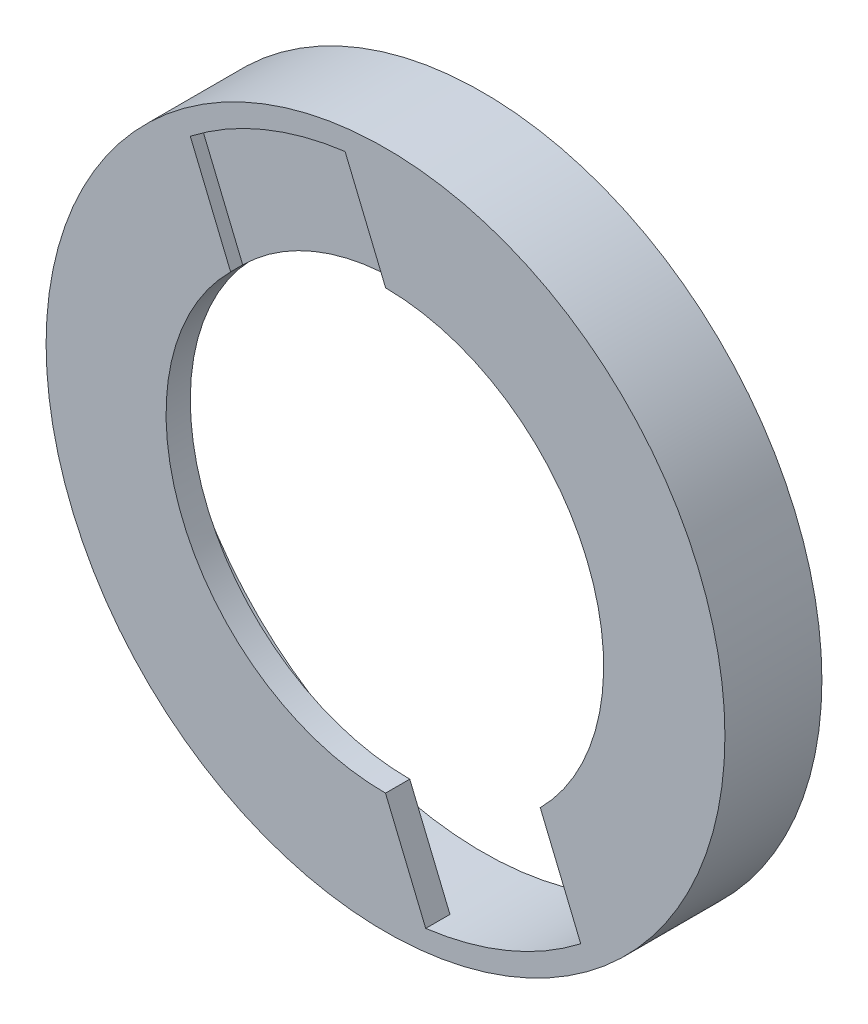
ISO-10303-21;
HEADER;
FILE_DESCRIPTION(('STEP AP214'),'2;1');
FILE_NAME('part.step','',(''),(''),'','','');
FILE_SCHEMA(('AUTOMOTIVE_DESIGN { 1 0 10303 214 1 1 1 1 }'));
ENDSEC;
DATA;
#1=APPLICATION_CONTEXT('core data for automotive mechanical design processes');
#2=APPLICATION_PROTOCOL_DEFINITION('international standard','automotive_design',2000,#1);
#3=PRODUCT_CONTEXT('',#1,'mechanical');
#4=PRODUCT('Part','Part','',(#3));
#5=PRODUCT_RELATED_PRODUCT_CATEGORY('part','',(#4));
#6=PRODUCT_DEFINITION_FORMATION('','',#4);
#7=PRODUCT_DEFINITION_CONTEXT('part definition',#1,'design');
#8=PRODUCT_DEFINITION('design','',#6,#7);
#9=PRODUCT_DEFINITION_SHAPE('','',#8);
#10=(LENGTH_UNIT() NAMED_UNIT(*) SI_UNIT(.MILLI.,.METRE.));
#11=(NAMED_UNIT(*) PLANE_ANGLE_UNIT() SI_UNIT($,.RADIAN.));
#12=(NAMED_UNIT(*) SI_UNIT($,.STERADIAN.) SOLID_ANGLE_UNIT());
#13=UNCERTAINTY_MEASURE_WITH_UNIT(LENGTH_MEASURE(1.E-05),#10,'distance_accuracy_value','');
#14=(GEOMETRIC_REPRESENTATION_CONTEXT(3) GLOBAL_UNCERTAINTY_ASSIGNED_CONTEXT((#13)) GLOBAL_UNIT_ASSIGNED_CONTEXT((#10,
#11,#12)) REPRESENTATION_CONTEXT('',''));
#15=CARTESIAN_POINT('',(0.,0.,0.));
#16=DIRECTION('',(0.,0.,1.));
#17=DIRECTION('',(1.,0.,0.));
#18=AXIS2_PLACEMENT_3D('',#15,#16,#17);
#19=CARTESIAN_POINT('',(0.0268247608232734,0.0172292833440261,0.));
#20=DIRECTION('',(0.,0.,1.));
#21=DIRECTION('',(1.,0.,0.));
#22=AXIS2_PLACEMENT_3D('',#19,#20,#21);
#23=PLANE('',#22);
#24=DIRECTION('',(0.38268343236509,-0.923879532511287,0.));
#25=VECTOR('',#24,1.);
#26=CARTESIAN_POINT('',(-3.16790889002571,-1.31219082661095,0.));
#27=LINE('',#26,#25);
#28=CARTESIAN_POINT('',(0.0268247608232715,-9.02496013466025,0.));
#29=VERTEX_POINT('',#28);
#30=CARTESIAN_POINT('',(1.68486505903116,-13.0278235095549,0.));
#31=VERTEX_POINT('',#30);
#32=EDGE_CURVE('E56',#29,#31,#27,.T.);
#33=ORIENTED_EDGE('',*,*,#32,.T.);
#34=CARTESIAN_POINT('',(0.0268247608232734,0.0172292833440261,0.));
#35=DIRECTION('',(0.,0.,1.));
#36=DIRECTION('',(1.,0.,0.));
#37=AXIS2_PLACEMENT_3D('',#34,#35,#36);
#38=CIRCLE('',#37,13.15);
#39=CARTESIAN_POINT('',(8.07865851327523,-10.3794275457946,0.));
#40=VERTEX_POINT('',#39);
#41=EDGE_CURVE('E179',#40,#31,#38,.T.);
#42=ORIENTED_EDGE('',*,*,#41,.F.);
#43=DIRECTION('',(0.38268343236509,-0.923879532511287,0.));
#44=VECTOR('',#43,1.);
#45=CARTESIAN_POINT('',(3.22588456421837,1.33620513714927,0.));
#46=LINE('',#45,#44);
#47=CARTESIAN_POINT('',(6.42061821506745,-6.37656417090026,0.));
#48=VERTEX_POINT('',#47);
#49=EDGE_CURVE('E156',#48,#40,#46,.T.);
#50=ORIENTED_EDGE('',*,*,#49,.F.);
#51=DIRECTION('',(0.707106781186541,-0.707106781186554,0.));
#52=VECTOR('',#51,1.);
#53=CARTESIAN_POINT('',(0.02202702208365,0.0220270220836496,0.));
#54=LINE('',#53,#52);
#55=CARTESIAN_POINT('',(6.40362770767166,-6.35957366350448,0.));
#56=VERTEX_POINT('',#55);
#57=EDGE_CURVE('E137',#56,#48,#54,.T.);
#58=ORIENTED_EDGE('',*,*,#57,.F.);
#59=CARTESIAN_POINT('',(0.,0.,0.));
#60=DIRECTION('',(0.,0.,1.));
#61=DIRECTION('',(1.,0.,0.));
#62=AXIS2_PLACEMENT_3D('',#59,#60,#61);
#63=CIRCLE('',#62,9.025);
#64=EDGE_CURVE('E162',#56,#29,#63,.T.);
#65=ORIENTED_EDGE('',*,*,#64,.T.);
#66=EDGE_LOOP('',(#33,#42,#50,#58,#65));
#67=FACE_BOUND('',#66,.T.);
#68=ADVANCED_FACE('F33',(#67),#23,.F.);
#69=CARTESIAN_POINT('',(0.0268247608232734,0.0172292833440261,-3.));
#70=DIRECTION('',(0.,0.,1.));
#71=DIRECTION('',(1.,0.,0.));
#72=AXIS2_PLACEMENT_3D('',#69,#70,#71);
#73=CYLINDRICAL_SURFACE('',#72,14.);
#74=CARTESIAN_POINT('',(0.0268247608232734,0.0172292833440261,-3.));
#75=DIRECTION('',(0.,0.,1.));
#76=DIRECTION('',(1.,0.,0.));
#77=AXIS2_PLACEMENT_3D('',#74,#75,#76);
#78=CIRCLE('',#77,14.);
#79=CARTESIAN_POINT('',(14.0268247608233,0.0172292833440261,-3.));
#80=VERTEX_POINT('',#79);
#81=EDGE_CURVE('E11',#80,#80,#78,.T.);
#82=ORIENTED_EDGE('',*,*,#81,.T.);
#83=EDGE_LOOP('',(#82));
#84=FACE_BOUND('',#83,.T.);
#85=CARTESIAN_POINT('',(0.0268247608232734,0.0172292833440261,1.));
#86=DIRECTION('',(0.,0.,1.));
#87=DIRECTION('',(1.,0.,0.));
#88=AXIS2_PLACEMENT_3D('',#85,#86,#87);
#89=CIRCLE('',#88,14.);
#90=CARTESIAN_POINT('',(14.0268247608233,0.0172292833440261,1.));
#91=VERTEX_POINT('',#90);
#92=EDGE_CURVE('E173',#91,#91,#89,.T.);
#93=ORIENTED_EDGE('',*,*,#92,.F.);
#94=EDGE_LOOP('',(#93));
#95=FACE_BOUND('',#94,.T.);
#96=ADVANCED_FACE('F35',(#84,#95),#73,.T.);
#97=CARTESIAN_POINT('',(0.0268247608232734,0.0172292833440261,-3.));
#98=DIRECTION('',(0.,0.,1.));
#99=DIRECTION('',(1.,0.,0.));
#100=AXIS2_PLACEMENT_3D('',#97,#98,#99);
#101=PLANE('',#100);
#102=CARTESIAN_POINT('',(0.0268247608232734,0.0172292833440261,-3.));
#103=DIRECTION('',(0.,0.,1.));
#104=DIRECTION('',(1.,0.,0.));
#105=AXIS2_PLACEMENT_3D('',#102,#103,#104);
#106=CIRCLE('',#105,13.15);
#107=CARTESIAN_POINT('',(13.1768247608233,0.0172292833440261,-3.));
#108=VERTEX_POINT('',#107);
#109=EDGE_CURVE('E41',#108,#108,#106,.T.);
#110=ORIENTED_EDGE('',*,*,#109,.T.);
#111=EDGE_LOOP('',(#110));
#112=FACE_BOUND('',#111,.T.);
#113=ORIENTED_EDGE('',*,*,#81,.F.);
#114=EDGE_LOOP('',(#113));
#115=FACE_BOUND('',#114,.T.);
#116=ADVANCED_FACE('F220',(#112,#115),#101,.F.);
#117=CARTESIAN_POINT('',(0.0268247608232734,0.0172292833440261,-3.));
#118=DIRECTION('',(0.,0.,1.));
#119=DIRECTION('',(1.,0.,0.));
#120=AXIS2_PLACEMENT_3D('',#117,#118,#119);
#121=CYLINDRICAL_SURFACE('',#120,13.15);
#122=ORIENTED_EDGE('',*,*,#109,.F.);
#123=EDGE_LOOP('',(#122));
#124=FACE_BOUND('',#123,.T.);
#125=ORIENTED_EDGE('',*,*,#41,.T.);
#126=DIRECTION('',(0.,0.,-1.));
#127=VECTOR('',#126,1.);
#128=CARTESIAN_POINT('',(1.68486505903116,-13.0278235095549,1.));
#129=LINE('',#128,#127);
#130=CARTESIAN_POINT('',(1.68486505903116,-13.0278235095549,1.));
#131=VERTEX_POINT('',#130);
#132=EDGE_CURVE('E165',#131,#31,#129,.T.);
#133=ORIENTED_EDGE('',*,*,#132,.F.);
#134=CARTESIAN_POINT('',(0.0268247608232734,0.0172292833440261,1.));
#135=DIRECTION('',(0.,0.,-1.));
#136=DIRECTION('',(-1.,0.,0.));
#137=AXIS2_PLACEMENT_3D('',#134,#135,#136);
#138=CIRCLE('',#137,13.15);
#139=CARTESIAN_POINT('',(8.07865851327523,-10.3794275457946,1.));
#140=VERTEX_POINT('',#139);
#141=EDGE_CURVE('E148',#140,#131,#138,.T.);
#142=ORIENTED_EDGE('',*,*,#141,.F.);
#143=DIRECTION('',(0.,0.,-1.));
#144=VECTOR('',#143,1.);
#145=CARTESIAN_POINT('',(8.07865851327523,-10.3794275457946,1.));
#146=LINE('',#145,#144);
#147=EDGE_CURVE('E167',#140,#40,#146,.T.);
#148=ORIENTED_EDGE('',*,*,#147,.T.);
#149=EDGE_LOOP('',(#125,#133,#142,#148));
#150=FACE_BOUND('',#149,.T.);
#151=ADVANCED_FACE('F185',(#124,#150),#121,.F.);
#152=CARTESIAN_POINT('',(0.0268247608232734,0.0172292833440261,1.));
#153=DIRECTION('',(0.,0.,1.));
#154=DIRECTION('',(1.,0.,0.));
#155=AXIS2_PLACEMENT_3D('',#152,#153,#154);
#156=PLANE('',#155);
#157=DIRECTION('',(-0.38268343236509,0.923879532511287,0.));
#158=VECTOR('',#157,1.);
#159=CARTESIAN_POINT('',(3.21738931052048,1.33268628785181,1.));
#160=LINE('',#159,#158);
#161=CARTESIAN_POINT('',(0.0311509133693049,9.02494623920809,1.));
#162=VERTEX_POINT('',#161);
#163=CARTESIAN_POINT('',(-1.64066919748248,13.0610770246746,1.));
#164=VERTEX_POINT('',#163);
#165=EDGE_CURVE('E111',#162,#164,#160,.T.);
#166=ORIENTED_EDGE('',*,*,#165,.F.);
#167=CARTESIAN_POINT('',(0.,0.,1.));
#168=DIRECTION('',(0.,0.,1.));
#169=DIRECTION('',(1.,0.,0.));
#170=AXIS2_PLACEMENT_3D('',#167,#168,#169);
#171=CIRCLE('',#170,9.025);
#172=CARTESIAN_POINT('',(6.40362770767166,-6.35957366350448,1.));
#173=VERTEX_POINT('',#172);
#174=EDGE_CURVE('E170',#173,#162,#171,.T.);
#175=ORIENTED_EDGE('',*,*,#174,.F.);
#176=DIRECTION('',(0.707106781186541,-0.707106781186554,0.));
#177=VECTOR('',#176,1.);
#178=CARTESIAN_POINT('',(0.02202702208365,0.0220270220836496,1.));
#179=LINE('',#178,#177);
#180=CARTESIAN_POINT('',(6.42061821506745,-6.37656417090026,1.));
#181=VERTEX_POINT('',#180);
#182=EDGE_CURVE('E142',#173,#181,#179,.T.);
#183=ORIENTED_EDGE('',*,*,#182,.T.);
#184=DIRECTION('',(0.38268343236509,-0.923879532511287,0.));
#185=VECTOR('',#184,1.);
#186=CARTESIAN_POINT('',(3.22588456421837,1.33620513714927,1.));
#187=LINE('',#186,#185);
#188=EDGE_CURVE('E145',#181,#140,#187,.T.);
#189=ORIENTED_EDGE('',*,*,#188,.T.);
#190=ORIENTED_EDGE('',*,*,#141,.T.);
#191=DIRECTION('',(0.38268343236509,-0.923879532511287,0.));
#192=VECTOR('',#191,1.);
#193=CARTESIAN_POINT('',(-3.16790889002571,-1.31219082661095,1.));
#194=LINE('',#193,#192);
#195=CARTESIAN_POINT('',(0.0268247608232734,-9.02496013466025,1.));
#196=VERTEX_POINT('',#195);
#197=EDGE_CURVE('E151',#196,#131,#194,.T.);
#198=ORIENTED_EDGE('',*,*,#197,.F.);
#199=CARTESIAN_POINT('',(-6.36264254087468,6.40057848143836,1.));
#200=VERTEX_POINT('',#199);
#201=EDGE_CURVE('E174',#200,#196,#171,.T.);
#202=ORIENTED_EDGE('',*,*,#201,.F.);
#203=DIRECTION('',(-0.38268343236509,0.923879532511287,0.));
#204=VECTOR('',#203,1.);
#205=CARTESIAN_POINT('',(-3.1679088900257,-1.31219082661095,1.));
#206=LINE('',#205,#204);
#207=CARTESIAN_POINT('',(-8.02500899162868,10.4138861124827,1.));
#208=VERTEX_POINT('',#207);
#209=EDGE_CURVE('E125',#200,#208,#206,.T.);
#210=ORIENTED_EDGE('',*,*,#209,.T.);
#211=CARTESIAN_POINT('',(0.0268247608232734,0.0172292833440261,1.));
#212=DIRECTION('',(0.,0.,1.));
#213=DIRECTION('',(1.,0.,0.));
#214=AXIS2_PLACEMENT_3D('',#211,#212,#213);
#215=CIRCLE('',#214,13.15);
#216=EDGE_CURVE('E128',#164,#208,#215,.T.);
#217=ORIENTED_EDGE('',*,*,#216,.F.);
#218=EDGE_LOOP('',(#166,#175,#183,#189,#190,#198,#202,#210,#217));
#219=FACE_BOUND('',#218,.T.);
#220=ORIENTED_EDGE('',*,*,#92,.T.);
#221=EDGE_LOOP('',(#220));
#222=FACE_BOUND('',#221,.T.);
#223=ADVANCED_FACE('F199',(#219,#222),#156,.T.);
#224=CARTESIAN_POINT('',(0.,0.,1.));
#225=DIRECTION('',(0.,0.,-1.));
#226=DIRECTION('',(-1.,0.,0.));
#227=AXIS2_PLACEMENT_3D('',#224,#225,#226);
#228=CYLINDRICAL_SURFACE('',#227,9.025);
#229=DIRECTION('',(0.,0.,1.));
#230=VECTOR('',#229,1.);
#231=CARTESIAN_POINT('',(0.0311509133693049,9.02494623920809,0.5));
#232=LINE('',#231,#230);
#233=CARTESIAN_POINT('',(0.0311509133693049,9.02494623920809,0.5));
#234=VERTEX_POINT('',#233);
#235=EDGE_CURVE('E135',#234,#162,#232,.T.);
#236=ORIENTED_EDGE('',*,*,#235,.F.);
#237=CARTESIAN_POINT('',(0.,0.,0.5));
#238=DIRECTION('',(0.,0.,1.));
#239=DIRECTION('',(1.,0.,0.));
#240=AXIS2_PLACEMENT_3D('',#237,#238,#239);
#241=CIRCLE('',#240,9.025);
#242=CARTESIAN_POINT('',(-6.36264254087468,6.40057848143836,0.5));
#243=VERTEX_POINT('',#242);
#244=EDGE_CURVE('E116',#243,#234,#241,.F.);
#245=ORIENTED_EDGE('',*,*,#244,.F.);
#246=DIRECTION('',(0.,0.,1.));
#247=VECTOR('',#246,1.);
#248=CARTESIAN_POINT('',(-6.36264254087468,6.40057848143836,0.5));
#249=LINE('',#248,#247);
#250=EDGE_CURVE('E138',#243,#200,#249,.T.);
#251=ORIENTED_EDGE('',*,*,#250,.T.);
#252=ORIENTED_EDGE('',*,*,#201,.T.);
#253=DIRECTION('',(0.,0.,-1.));
#254=VECTOR('',#253,1.);
#255=CARTESIAN_POINT('',(0.0268247608232734,-9.02496013466025,1.));
#256=LINE('',#255,#254);
#257=EDGE_CURVE('E163',#196,#29,#256,.T.);
#258=ORIENTED_EDGE('',*,*,#257,.T.);
#259=ORIENTED_EDGE('',*,*,#64,.F.);
#260=DIRECTION('',(0.,0.,-1.));
#261=VECTOR('',#260,1.);
#262=CARTESIAN_POINT('',(6.40362770767166,-6.35957366350448,1.));
#263=LINE('',#262,#261);
#264=EDGE_CURVE('E160',#173,#56,#263,.T.);
#265=ORIENTED_EDGE('',*,*,#264,.F.);
#266=ORIENTED_EDGE('',*,*,#174,.T.);
#267=EDGE_LOOP('',(#236,#245,#251,#252,#258,#259,#265,#266));
#268=FACE_BOUND('',#267,.T.);
#269=ADVANCED_FACE('F193',(#268),#228,.F.);
#270=CARTESIAN_POINT('',(0.02202702208365,0.0220270220836496,1.));
#271=DIRECTION('',(0.707106781186554,0.707106781186541,0.));
#272=DIRECTION('',(-0.707106781186541,0.707106781186554,0.));
#273=AXIS2_PLACEMENT_3D('',#270,#271,#272);
#274=PLANE('',#273);
#275=ORIENTED_EDGE('',*,*,#57,.T.);
#276=DIRECTION('',(0.,0.,-1.));
#277=VECTOR('',#276,1.);
#278=CARTESIAN_POINT('',(6.42061821506745,-6.37656417090026,1.));
#279=LINE('',#278,#277);
#280=EDGE_CURVE('E153',#181,#48,#279,.T.);
#281=ORIENTED_EDGE('',*,*,#280,.F.);
#282=ORIENTED_EDGE('',*,*,#182,.F.);
#283=ORIENTED_EDGE('',*,*,#264,.T.);
#284=EDGE_LOOP('',(#275,#281,#282,#283));
#285=FACE_BOUND('',#284,.T.);
#286=ADVANCED_FACE('F205',(#285),#274,.F.);
#287=CARTESIAN_POINT('',(-3.16790889002571,-1.31219082661095,1.));
#288=DIRECTION('',(0.923879532511287,0.38268343236509,0.));
#289=DIRECTION('',(-0.38268343236509,0.923879532511287,0.));
#290=AXIS2_PLACEMENT_3D('',#287,#288,#289);
#291=PLANE('',#290);
#292=ORIENTED_EDGE('',*,*,#32,.F.);
#293=ORIENTED_EDGE('',*,*,#257,.F.);
#294=ORIENTED_EDGE('',*,*,#197,.T.);
#295=ORIENTED_EDGE('',*,*,#132,.T.);
#296=EDGE_LOOP('',(#292,#293,#294,#295));
#297=FACE_BOUND('',#296,.T.);
#298=ADVANCED_FACE('F197',(#297),#291,.T.);
#299=CARTESIAN_POINT('',(3.22588456421837,1.33620513714927,1.));
#300=DIRECTION('',(0.923879532511287,0.38268343236509,0.));
#301=DIRECTION('',(-0.38268343236509,0.923879532511287,0.));
#302=AXIS2_PLACEMENT_3D('',#299,#300,#301);
#303=PLANE('',#302);
#304=ORIENTED_EDGE('',*,*,#49,.T.);
#305=ORIENTED_EDGE('',*,*,#147,.F.);
#306=ORIENTED_EDGE('',*,*,#188,.F.);
#307=ORIENTED_EDGE('',*,*,#280,.T.);
#308=EDGE_LOOP('',(#304,#305,#306,#307));
#309=FACE_BOUND('',#308,.T.);
#310=ADVANCED_FACE('F203',(#309),#303,.F.);
#311=CARTESIAN_POINT('',(3.21738931052048,1.33268628785181,0.5));
#312=DIRECTION('',(0.923879532511287,0.38268343236509,0.));
#313=DIRECTION('',(-0.38268343236509,0.923879532511287,0.));
#314=AXIS2_PLACEMENT_3D('',#311,#312,#313);
#315=PLANE('',#314);
#316=ORIENTED_EDGE('',*,*,#165,.T.);
#317=DIRECTION('',(0.,0.,1.));
#318=VECTOR('',#317,1.);
#319=CARTESIAN_POINT('',(-1.64066919748248,13.0610770246746,0.5));
#320=LINE('',#319,#318);
#321=CARTESIAN_POINT('',(-1.64066919748248,13.0610770246746,0.5));
#322=VERTEX_POINT('',#321);
#323=EDGE_CURVE('E105',#322,#164,#320,.T.);
#324=ORIENTED_EDGE('',*,*,#323,.F.);
#325=DIRECTION('',(-0.38268343236509,0.923879532511287,0.));
#326=VECTOR('',#325,1.);
#327=CARTESIAN_POINT('',(3.21738931052048,1.33268628785181,0.5));
#328=LINE('',#327,#326);
#329=EDGE_CURVE('E109',#234,#322,#328,.T.);
#330=ORIENTED_EDGE('',*,*,#329,.F.);
#331=ORIENTED_EDGE('',*,*,#235,.T.);
#332=EDGE_LOOP('',(#316,#324,#330,#331));
#333=FACE_BOUND('',#332,.T.);
#334=ADVANCED_FACE('F107',(#333),#315,.F.);
#335=CARTESIAN_POINT('',(-3.1679088900257,-1.31219082661095,0.5));
#336=DIRECTION('',(0.923879532511287,0.38268343236509,0.));
#337=DIRECTION('',(-0.38268343236509,0.923879532511287,0.));
#338=AXIS2_PLACEMENT_3D('',#335,#336,#337);
#339=PLANE('',#338);
#340=ORIENTED_EDGE('',*,*,#209,.F.);
#341=ORIENTED_EDGE('',*,*,#250,.F.);
#342=DIRECTION('',(-0.38268343236509,0.923879532511287,0.));
#343=VECTOR('',#342,1.);
#344=CARTESIAN_POINT('',(-3.1679088900257,-1.31219082661095,0.5));
#345=LINE('',#344,#343);
#346=CARTESIAN_POINT('',(-8.02500899162868,10.4138861124827,0.5));
#347=VERTEX_POINT('',#346);
#348=EDGE_CURVE('E48',#243,#347,#345,.T.);
#349=ORIENTED_EDGE('',*,*,#348,.T.);
#350=DIRECTION('',(0.,0.,1.));
#351=VECTOR('',#350,1.);
#352=CARTESIAN_POINT('',(-8.02500899162868,10.4138861124827,0.5));
#353=LINE('',#352,#351);
#354=EDGE_CURVE('E115',#347,#208,#353,.T.);
#355=ORIENTED_EDGE('',*,*,#354,.T.);
#356=EDGE_LOOP('',(#340,#341,#349,#355));
#357=FACE_BOUND('',#356,.T.);
#358=ADVANCED_FACE('F255',(#357),#339,.T.);
#359=CARTESIAN_POINT('',(0.0268247608232734,0.0172292833440261,0.5));
#360=DIRECTION('',(0.,0.,1.));
#361=DIRECTION('',(1.,0.,0.));
#362=AXIS2_PLACEMENT_3D('',#359,#360,#361);
#363=CYLINDRICAL_SURFACE('',#362,13.15);
#364=ORIENTED_EDGE('',*,*,#216,.T.);
#365=ORIENTED_EDGE('',*,*,#354,.F.);
#366=CARTESIAN_POINT('',(0.0268247608232734,0.0172292833440261,0.5));
#367=DIRECTION('',(0.,0.,1.));
#368=DIRECTION('',(1.,0.,0.));
#369=AXIS2_PLACEMENT_3D('',#366,#367,#368);
#370=CIRCLE('',#369,13.15);
#371=EDGE_CURVE('E119',#322,#347,#370,.T.);
#372=ORIENTED_EDGE('',*,*,#371,.F.);
#373=ORIENTED_EDGE('',*,*,#323,.T.);
#374=EDGE_LOOP('',(#364,#365,#372,#373));
#375=FACE_BOUND('',#374,.T.);
#376=ADVANCED_FACE('F120',(#375),#363,.F.);
#377=CARTESIAN_POINT('',(0.,0.,0.5));
#378=DIRECTION('',(0.,0.,1.));
#379=DIRECTION('',(1.,0.,0.));
#380=AXIS2_PLACEMENT_3D('',#377,#378,#379);
#381=PLANE('',#380);
#382=ORIENTED_EDGE('',*,*,#329,.T.);
#383=ORIENTED_EDGE('',*,*,#371,.T.);
#384=ORIENTED_EDGE('',*,*,#348,.F.);
#385=ORIENTED_EDGE('',*,*,#244,.T.);
#386=EDGE_LOOP('',(#382,#383,#384,#385));
#387=FACE_BOUND('',#386,.T.);
#388=ADVANCED_FACE('F122',(#387),#381,.T.);
#389=CLOSED_SHELL('',(#68,#96,#116,#151,#223,#269,#286,#298,#310,#334,#358,#376,#388));
#390=MANIFOLD_SOLID_BREP('B2',#389);
#391=ADVANCED_BREP_SHAPE_REPRESENTATION('',(#18,#390),#14);
#392=SHAPE_DEFINITION_REPRESENTATION(#9,#391);
ENDSEC;
END-ISO-10303-21;
